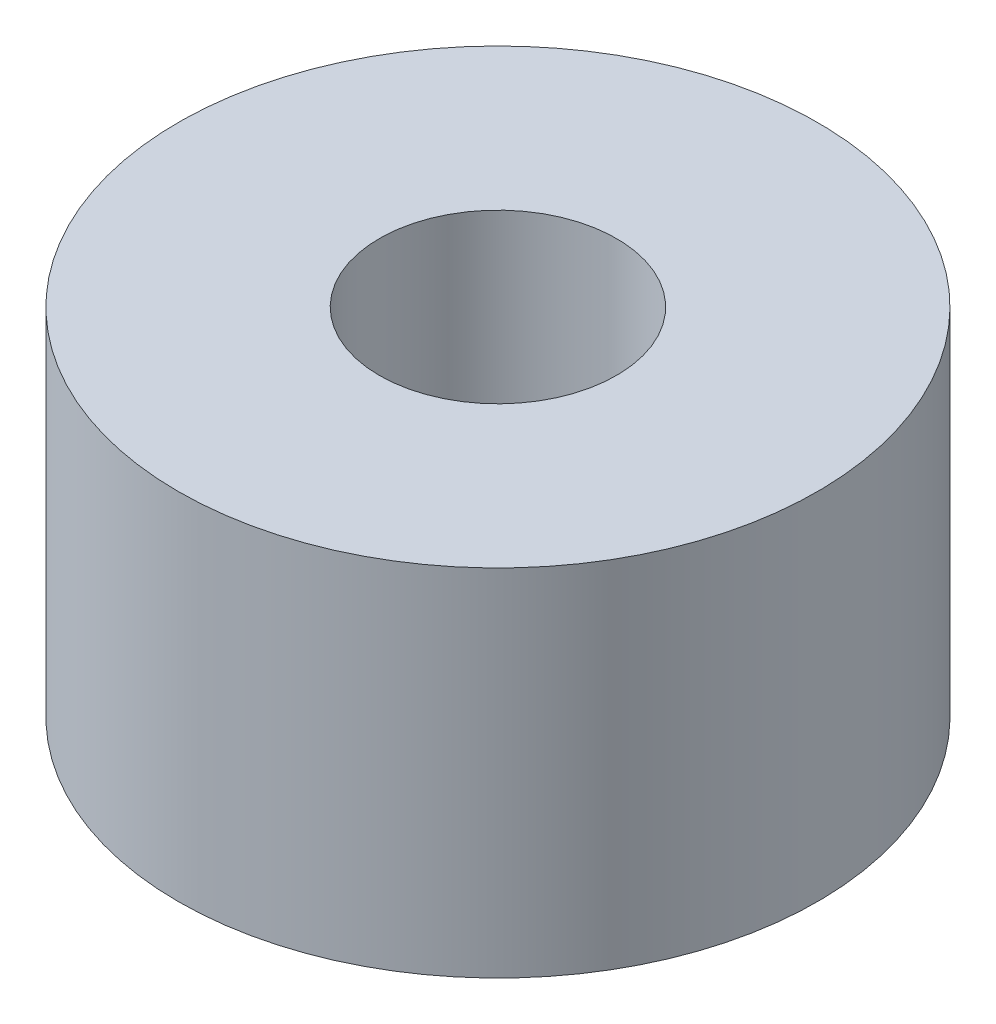
ISO-10303-21;
HEADER;
FILE_DESCRIPTION(('STEP AP214'),'2;1');
FILE_NAME('part.step','',(''),(''),'','','');
FILE_SCHEMA(('AUTOMOTIVE_DESIGN { 1 0 10303 214 1 1 1 1 }'));
ENDSEC;
DATA;
#1=APPLICATION_CONTEXT('core data for automotive mechanical design processes');
#2=APPLICATION_PROTOCOL_DEFINITION('international standard','automotive_design',2000,#1);
#3=PRODUCT_CONTEXT('',#1,'mechanical');
#4=PRODUCT('Part','Part','',(#3));
#5=PRODUCT_RELATED_PRODUCT_CATEGORY('part','',(#4));
#6=PRODUCT_DEFINITION_FORMATION('','',#4);
#7=PRODUCT_DEFINITION_CONTEXT('part definition',#1,'design');
#8=PRODUCT_DEFINITION('design','',#6,#7);
#9=PRODUCT_DEFINITION_SHAPE('','',#8);
#10=(LENGTH_UNIT() NAMED_UNIT(*) SI_UNIT(.MILLI.,.METRE.));
#11=(NAMED_UNIT(*) PLANE_ANGLE_UNIT() SI_UNIT($,.RADIAN.));
#12=(NAMED_UNIT(*) SI_UNIT($,.STERADIAN.) SOLID_ANGLE_UNIT());
#13=UNCERTAINTY_MEASURE_WITH_UNIT(LENGTH_MEASURE(1.E-05),#10,'distance_accuracy_value','');
#14=(GEOMETRIC_REPRESENTATION_CONTEXT(3) GLOBAL_UNCERTAINTY_ASSIGNED_CONTEXT((#13)) GLOBAL_UNIT_ASSIGNED_CONTEXT((#10,
#11,#12)) REPRESENTATION_CONTEXT('',''));
#15=CARTESIAN_POINT('',(0.,0.,0.));
#16=DIRECTION('',(0.,0.,1.));
#17=DIRECTION('',(1.,0.,0.));
#18=AXIS2_PLACEMENT_3D('',#15,#16,#17);
#19=CARTESIAN_POINT('',(0.,6.35,0.));
#20=DIRECTION('',(0.,1.,0.));
#21=DIRECTION('',(0.,0.,1.));
#22=AXIS2_PLACEMENT_3D('',#19,#20,#21);
#23=PLANE('',#22);
#24=CARTESIAN_POINT('',(0.,6.35,0.));
#25=DIRECTION('',(0.,1.,0.));
#26=DIRECTION('',(0.,0.,1.));
#27=AXIS2_PLACEMENT_3D('',#24,#25,#26);
#28=CIRCLE('',#27,5.715);
#29=CARTESIAN_POINT('',(0.,6.35,5.715));
#30=VERTEX_POINT('',#29);
#31=EDGE_CURVE('E10',#30,#30,#28,.T.);
#32=ORIENTED_EDGE('',*,*,#31,.T.);
#33=EDGE_LOOP('',(#32));
#34=FACE_BOUND('',#33,.T.);
#35=CARTESIAN_POINT('',(0.,6.35,0.));
#36=DIRECTION('',(0.,1.,0.));
#37=DIRECTION('',(0.,0.,1.));
#38=AXIS2_PLACEMENT_3D('',#35,#36,#37);
#39=CIRCLE('',#38,2.1209);
#40=CARTESIAN_POINT('',(0.,6.35,2.1209));
#41=VERTEX_POINT('',#40);
#42=EDGE_CURVE('E50',#41,#41,#39,.T.);
#43=ORIENTED_EDGE('',*,*,#42,.F.);
#44=EDGE_LOOP('',(#43));
#45=FACE_BOUND('',#44,.T.);
#46=ADVANCED_FACE('F37',(#34,#45),#23,.T.);
#47=CARTESIAN_POINT('',(0.,0.,0.));
#48=DIRECTION('',(0.,1.,0.));
#49=DIRECTION('',(0.,0.,1.));
#50=AXIS2_PLACEMENT_3D('',#47,#48,#49);
#51=PLANE('',#50);
#52=CARTESIAN_POINT('',(0.,0.,0.));
#53=DIRECTION('',(0.,1.,0.));
#54=DIRECTION('',(0.,0.,1.));
#55=AXIS2_PLACEMENT_3D('',#52,#53,#54);
#56=CIRCLE('',#55,5.715);
#57=CARTESIAN_POINT('',(0.,0.,5.715));
#58=VERTEX_POINT('',#57);
#59=EDGE_CURVE('E41',#58,#58,#56,.T.);
#60=ORIENTED_EDGE('',*,*,#59,.F.);
#61=EDGE_LOOP('',(#60));
#62=FACE_BOUND('',#61,.T.);
#63=CARTESIAN_POINT('',(0.,0.,0.));
#64=DIRECTION('',(0.,1.,0.));
#65=DIRECTION('',(0.,0.,1.));
#66=AXIS2_PLACEMENT_3D('',#63,#64,#65);
#67=CIRCLE('',#66,2.1209);
#68=CARTESIAN_POINT('',(0.,0.,2.1209));
#69=VERTEX_POINT('',#68);
#70=EDGE_CURVE('E52',#69,#69,#67,.T.);
#71=ORIENTED_EDGE('',*,*,#70,.T.);
#72=EDGE_LOOP('',(#71));
#73=FACE_BOUND('',#72,.T.);
#74=ADVANCED_FACE('F64',(#62,#73),#51,.F.);
#75=CARTESIAN_POINT('',(0.,6.35,0.));
#76=DIRECTION('',(0.,-1.,0.));
#77=DIRECTION('',(0.,0.,-1.));
#78=AXIS2_PLACEMENT_3D('',#75,#76,#77);
#79=CYLINDRICAL_SURFACE('',#78,5.715);
#80=ORIENTED_EDGE('',*,*,#31,.F.);
#81=EDGE_LOOP('',(#80));
#82=FACE_BOUND('',#81,.T.);
#83=ORIENTED_EDGE('',*,*,#59,.T.);
#84=EDGE_LOOP('',(#83));
#85=FACE_BOUND('',#84,.T.);
#86=ADVANCED_FACE('F39',(#82,#85),#79,.T.);
#87=CARTESIAN_POINT('',(0.,6.35,0.));
#88=DIRECTION('',(0.,-1.,0.));
#89=DIRECTION('',(0.,0.,-1.));
#90=AXIS2_PLACEMENT_3D('',#87,#88,#89);
#91=CYLINDRICAL_SURFACE('',#90,2.1209);
#92=ORIENTED_EDGE('',*,*,#42,.T.);
#93=EDGE_LOOP('',(#92));
#94=FACE_BOUND('',#93,.T.);
#95=ORIENTED_EDGE('',*,*,#70,.F.);
#96=EDGE_LOOP('',(#95));
#97=FACE_BOUND('',#96,.T.);
#98=ADVANCED_FACE('F60',(#94,#97),#91,.F.);
#99=CLOSED_SHELL('',(#46,#74,#86,#98));
#100=MANIFOLD_SOLID_BREP('B2',#99);
#101=ADVANCED_BREP_SHAPE_REPRESENTATION('',(#18,#100),#14);
#102=SHAPE_DEFINITION_REPRESENTATION(#9,#101);
ENDSEC;
END-ISO-10303-21;
